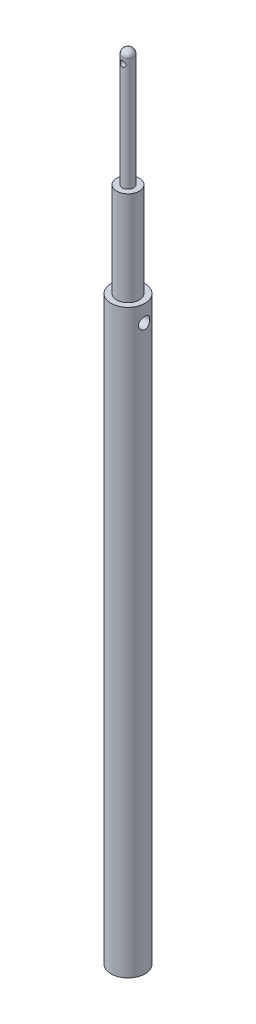
ISO-10303-21;
HEADER;
FILE_DESCRIPTION(('STEP AP214'),'2;1');
FILE_NAME('part.step','',(''),(''),'','','');
FILE_SCHEMA(('AUTOMOTIVE_DESIGN { 1 0 10303 214 1 1 1 1 }'));
ENDSEC;
DATA;
#1=APPLICATION_CONTEXT('core data for automotive mechanical design processes');
#2=APPLICATION_PROTOCOL_DEFINITION('international standard','automotive_design',2000,#1);
#3=PRODUCT_CONTEXT('',#1,'mechanical');
#4=PRODUCT('Part','Part','',(#3));
#5=PRODUCT_RELATED_PRODUCT_CATEGORY('part','',(#4));
#6=PRODUCT_DEFINITION_FORMATION('','',#4);
#7=PRODUCT_DEFINITION_CONTEXT('part definition',#1,'design');
#8=PRODUCT_DEFINITION('design','',#6,#7);
#9=PRODUCT_DEFINITION_SHAPE('','',#8);
#10=(LENGTH_UNIT() NAMED_UNIT(*) SI_UNIT(.MILLI.,.METRE.));
#11=(NAMED_UNIT(*) PLANE_ANGLE_UNIT() SI_UNIT($,.RADIAN.));
#12=(NAMED_UNIT(*) SI_UNIT($,.STERADIAN.) SOLID_ANGLE_UNIT());
#13=UNCERTAINTY_MEASURE_WITH_UNIT(LENGTH_MEASURE(1.E-05),#10,'distance_accuracy_value','');
#14=(GEOMETRIC_REPRESENTATION_CONTEXT(3) GLOBAL_UNCERTAINTY_ASSIGNED_CONTEXT((#13)) GLOBAL_UNIT_ASSIGNED_CONTEXT((#10,
#11,#12)) REPRESENTATION_CONTEXT('',''));
#15=CARTESIAN_POINT('',(0.,0.,0.));
#16=DIRECTION('',(0.,0.,1.));
#17=DIRECTION('',(1.,0.,0.));
#18=AXIS2_PLACEMENT_3D('',#15,#16,#17);
#19=CARTESIAN_POINT('',(0.,418.,0.));
#20=DIRECTION('',(0.,-1.,0.));
#21=DIRECTION('',(-1.,0.,0.));
#22=AXIS2_PLACEMENT_3D('',#19,#20,#21);
#23=SPHERICAL_SURFACE('',#22,3.);
#24=CARTESIAN_POINT('',(0.,421.,0.));
#25=VERTEX_POINT('',#24);
#26=VERTEX_LOOP('',#25);
#27=FACE_BOUND('',#26,.T.);
#28=CARTESIAN_POINT('',(0.,418.,0.));
#29=DIRECTION('',(0.,-1.,0.));
#30=DIRECTION('',(0.,0.,-1.));
#31=AXIS2_PLACEMENT_3D('',#28,#29,#30);
#32=CIRCLE('',#31,3.);
#33=CARTESIAN_POINT('',(0.,418.,-3.));
#34=VERTEX_POINT('',#33);
#35=EDGE_CURVE('E37',#34,#34,#32,.T.);
#36=ORIENTED_EDGE('',*,*,#35,.F.);
#37=EDGE_LOOP('',(#36));
#38=FACE_BOUND('',#37,.T.);
#39=ADVANCED_FACE('F17',(#27,#38),#23,.T.);
#40=CARTESIAN_POINT('',(0.,415.,30.));
#41=DIRECTION('',(0.,0.,-1.));
#42=DIRECTION('',(-1.,0.,0.));
#43=AXIS2_PLACEMENT_3D('',#40,#41,#42);
#44=CYLINDRICAL_SURFACE('',#43,1.5);
#45=CARTESIAN_POINT('',(0.,416.5,3.));
#46=CARTESIAN_POINT('',(0.0789523741883106,416.499997914213,2.9999981238286));
#47=CARTESIAN_POINT('',(0.157924422035615,416.493737423984,2.99685384899897));
#48=CARTESIAN_POINT('',(0.313468681382338,416.468995866764,2.98459986704362));
#49=CARTESIAN_POINT('',(0.390039424776912,416.450507470791,2.97548658233272));
#50=CARTESIAN_POINT('',(0.538393460729509,416.402212709136,2.95224590208733));
#51=CARTESIAN_POINT('',(0.610191918802864,416.372444430996,2.93813539050944));
#52=CARTESIAN_POINT('',(0.747690654482896,416.302654617508,2.90619133889545));
#53=CARTESIAN_POINT('',(0.813389793992892,416.262631173826,2.88835710604406));
#54=CARTESIAN_POINT('',(0.941259980854336,416.170725678538,2.84934448667486));
#55=CARTESIAN_POINT('',(1.00297910670001,416.11827390396,2.8280292644071));
#56=CARTESIAN_POINT('',(1.11716598235844,416.00422104557,2.78490088151737));
#57=CARTESIAN_POINT('',(1.16962611906243,415.942612508662,2.76308732763712));
#58=CARTESIAN_POINT('',(1.2678966211791,415.806250706469,2.71947586721745));
#59=CARTESIAN_POINT('',(1.31287039536179,415.730847279031,2.69781160488922));
#60=CARTESIAN_POINT('',(1.38927657431044,415.57238018469,2.65927731616469));
#61=CARTESIAN_POINT('',(1.42072856328026,415.48932780939,2.64240036823136));
#62=CARTESIAN_POINT('',(1.46288309546822,415.338461546562,2.61923702018133));
#63=CARTESIAN_POINT('',(1.47675163527823,415.271764532079,2.61138198601866));
#64=CARTESIAN_POINT('',(1.49530884891063,415.136716168768,2.60080147997309));
#65=CARTESIAN_POINT('',(1.50000210008705,415.068365662072,2.59807345036424));
#66=CARTESIAN_POINT('',(1.49999759610631,414.921744299183,2.59807937175766));
#67=CARTESIAN_POINT('',(1.49384308337466,414.843468740957,2.60166056499265));
#68=CARTESIAN_POINT('',(1.46956160576775,414.6893774637,2.61544904004607));
#69=CARTESIAN_POINT('',(1.4514242506472,414.61356393939,2.62566207215737));
#70=CARTESIAN_POINT('',(1.40415297324932,414.46682809588,2.65123842070865));
#71=CARTESIAN_POINT('',(1.37507197720972,414.395884148246,2.66657690975751));
#72=CARTESIAN_POINT('',(1.30691055280204,414.2598801163,2.70063556141322));
#73=CARTESIAN_POINT('',(1.26782719972848,414.194821760488,2.71935671264451));
#74=CARTESIAN_POINT('',(1.17700144915982,414.06654330466,2.75995233668311));
#75=CARTESIAN_POINT('',(1.1244818489178,414.003915326102,2.78195952506143));
#76=CARTESIAN_POINT('',(1.00988434252845,413.887890905829,2.82557834533606));
#77=CARTESIAN_POINT('',(0.947801083445087,413.83449966982,2.84718974807806));
#78=CARTESIAN_POINT('',(0.810712291773563,413.734932285602,2.88932940913989));
#79=CARTESIAN_POINT('',(0.735116337207858,413.6894897212,2.90968517210142));
#80=CARTESIAN_POINT('',(0.576173561147554,413.612266616582,2.94527160687147));
#81=CARTESIAN_POINT('',(0.492836933865574,413.580468409015,2.96050890072461));
#82=CARTESIAN_POINT('',(0.341164866635276,413.53771357908,2.98127923258904));
#83=CARTESIAN_POINT('',(0.273898570249011,413.523617159207,2.98825046347326));
#84=CARTESIAN_POINT('',(0.137759532534579,413.504760790713,2.99761101248802));
#85=CARTESIAN_POINT('',(0.0688872548996964,413.499998180116,3.00000163699064));
#86=CARTESIAN_POINT('',(-0.0789523741883066,413.500002085788,2.9999981238286));
#87=CARTESIAN_POINT('',(-0.15792442203561,413.506262576016,2.99685384899897));
#88=CARTESIAN_POINT('',(-0.313468681382333,413.531004133236,2.98459986704362));
#89=CARTESIAN_POINT('',(-0.390039424776908,413.549492529209,2.97548658233272));
#90=CARTESIAN_POINT('',(-0.538393460729497,413.597787290864,2.95224590208734));
#91=CARTESIAN_POINT('',(-0.610191918802843,413.627555569005,2.93813539050945));
#92=CARTESIAN_POINT('',(-0.747690654482877,413.697345382492,2.90619133889545));
#93=CARTESIAN_POINT('',(-0.813389793992883,413.737368826174,2.88835710604407));
#94=CARTESIAN_POINT('',(-0.941259980854335,413.829274321462,2.84934448667486));
#95=CARTESIAN_POINT('',(-1.00297910670001,413.88172609604,2.8280292644071));
#96=CARTESIAN_POINT('',(-1.11716598235844,413.99577895443,2.78490088151737));
#97=CARTESIAN_POINT('',(-1.16962611906243,414.057387491338,2.76308732763712));
#98=CARTESIAN_POINT('',(-1.2678966211791,414.193749293531,2.71947586721745));
#99=CARTESIAN_POINT('',(-1.31287039536179,414.269152720969,2.69781160488922));
#100=CARTESIAN_POINT('',(-1.38927657431045,414.42761981531,2.65927731616469));
#101=CARTESIAN_POINT('',(-1.42072856328026,414.510672190611,2.64240036823136));
#102=CARTESIAN_POINT('',(-1.46288309546822,414.661538453439,2.61923702018132));
#103=CARTESIAN_POINT('',(-1.47675163527823,414.728235467922,2.61138198601866));
#104=CARTESIAN_POINT('',(-1.49530884891063,414.863283831232,2.60080147997309));
#105=CARTESIAN_POINT('',(-1.50000210008706,414.931634337929,2.59807345036423));
#106=CARTESIAN_POINT('',(-1.4999975961063,415.078255700817,2.59807937175766));
#107=CARTESIAN_POINT('',(-1.49384308337464,415.156531259043,2.60166056499266));
#108=CARTESIAN_POINT('',(-1.46956160576772,415.310622536301,2.61544904004609));
#109=CARTESIAN_POINT('',(-1.45142425064716,415.38643606061,2.62566207215739));
#110=CARTESIAN_POINT('',(-1.40415297324927,415.53317190412,2.65123842070868));
#111=CARTESIAN_POINT('',(-1.37507197720967,415.604115851754,2.66657690975753));
#112=CARTESIAN_POINT('',(-1.30691055280198,415.740119883701,2.70063556141325));
#113=CARTESIAN_POINT('',(-1.26782719972841,415.805178239513,2.71935671264454));
#114=CARTESIAN_POINT('',(-1.17700144915974,415.933456695341,2.75995233668315));
#115=CARTESIAN_POINT('',(-1.12448184891771,415.996084673898,2.78195952506147));
#116=CARTESIAN_POINT('',(-1.00988434252833,416.112109094172,2.8255783453361));
#117=CARTESIAN_POINT('',(-0.947801083444956,416.16550033018,2.84718974807811));
#118=CARTESIAN_POINT('',(-0.810712291773417,416.265067714398,2.88932940913993));
#119=CARTESIAN_POINT('',(-0.735116337207713,416.3105102788,2.90968517210146));
#120=CARTESIAN_POINT('',(-0.576173561147404,416.387733383419,2.9452716068715));
#121=CARTESIAN_POINT('',(-0.492836933865418,416.419531590985,2.96050890072464));
#122=CARTESIAN_POINT('',(-0.341164866635138,416.462286420921,2.98127923258905));
#123=CARTESIAN_POINT('',(-0.273898570248898,416.476382840794,2.98825046347327));
#124=CARTESIAN_POINT('',(-0.13775953253452,416.495239209287,2.99761101248802));
#125=CARTESIAN_POINT('',(-0.0688872548996649,416.500001819884,3.00000163699064));
#126=CARTESIAN_POINT('',(0.,416.5,3.));
#127=B_SPLINE_CURVE_WITH_KNOTS('',3,(#45,#46,#47,#48,#49,#50,#51,#52,#53,#54,#55,#56,#57,#58,
#59,#60,#61,#62,#63,#64,#65,#66,#67,#68,#69,#70,#71,#72,#73,#74,#75,#76,#77,#78,#79,#80,#81,#82,
#83,#84,#85,#86,#87,#88,#89,#90,#91,#92,#93,#94,#95,#96,#97,#98,#99,#100,#101,#102,#103,#104,
#105,#106,#107,#108,#109,#110,#111,#112,#113,#114,#115,#116,#117,#118,#119,#120,#121,#122,#123,
#124,#125,#126),.UNSPECIFIED.,.T.,.F.,(4,2,2,2,2,2,2,2,2,2,2,2,2,2,2,2,2,2,2,2,2,2,2,2,2,2,2,2,
2,2,2,2,2,2,2,2,2,2,2,2,4),(0.,0.23659013586564,0.473322204293129,0.709261947423783,
0.945245627395742,1.19546508957278,1.44588934324943,1.7158254376272,1.98536924354221,
2.19032891955666,2.39518631948091,2.6296791761702,2.86437562742736,3.09795131726489,
3.33159538320307,3.58447159376566,3.83748986102485,4.10764473097401,4.37744872835912,
4.58393644104479,4.79036525542416,5.0269553912898,5.26368745971729,5.49962720284793,
5.73561088281991,5.98583034499694,6.23625459867359,6.50619069305137,6.77573449896638,
6.98069417498088,7.18555157490518,7.42004443159454,7.65474088285164,7.88831657268918,
8.12196063862737,8.37483684918999,8.62785511644916,8.89800998639833,9.16781398378345,
9.37430169646904,9.58073051084833),.UNSPECIFIED.);
#128=CARTESIAN_POINT('',(0.,416.5,3.));
#129=VERTEX_POINT('',#128);
#130=EDGE_CURVE('E21',#129,#129,#127,.T.);
#131=ORIENTED_EDGE('',*,*,#130,.F.);
#132=EDGE_LOOP('',(#131));
#133=FACE_BOUND('',#132,.T.);
#134=CARTESIAN_POINT('',(0.,413.5,-3.));
#135=CARTESIAN_POINT('',(0.0789523741883105,413.500002085788,-2.9999981238286));
#136=CARTESIAN_POINT('',(0.157924422035614,413.506262576016,-2.99685384899897));
#137=CARTESIAN_POINT('',(0.313468681382337,413.531004133236,-2.98459986704362));
#138=CARTESIAN_POINT('',(0.390039424776912,413.549492529209,-2.97548658233272));
#139=CARTESIAN_POINT('',(0.538393460729509,413.597787290864,-2.95224590208733));
#140=CARTESIAN_POINT('',(0.610191918802863,413.627555569005,-2.93813539050944));
#141=CARTESIAN_POINT('',(0.747690654482895,413.697345382492,-2.90619133889545));
#142=CARTESIAN_POINT('',(0.813389793992892,413.737368826174,-2.88835710604406));
#143=CARTESIAN_POINT('',(0.941259980854336,413.829274321462,-2.84934448667486));
#144=CARTESIAN_POINT('',(1.00297910670001,413.88172609604,-2.8280292644071));
#145=CARTESIAN_POINT('',(1.11716598235844,413.99577895443,-2.78490088151737));
#146=CARTESIAN_POINT('',(1.16962611906243,414.057387491338,-2.76308732763712));
#147=CARTESIAN_POINT('',(1.2678966211791,414.193749293531,-2.71947586721745));
#148=CARTESIAN_POINT('',(1.31287039536179,414.269152720969,-2.69781160488922));
#149=CARTESIAN_POINT('',(1.38927657431044,414.42761981531,-2.65927731616469));
#150=CARTESIAN_POINT('',(1.42072856328026,414.510672190611,-2.64240036823136));
#151=CARTESIAN_POINT('',(1.46288309546827,414.661538453439,-2.6192370201813));
#152=CARTESIAN_POINT('',(1.4767516352783,414.728235467922,-2.61138198601862));
#153=CARTESIAN_POINT('',(1.4953088489107,414.863283831233,-2.60080147997305));
#154=CARTESIAN_POINT('',(1.5000021000871,414.93163433793,-2.59807345036421));
#155=CARTESIAN_POINT('',(1.49999759610625,415.078255700818,-2.59807937175769));
#156=CARTESIAN_POINT('',(1.49384308337454,415.156531259044,-2.60166056499272));
#157=CARTESIAN_POINT('',(1.46956160576752,415.310622536302,-2.6154490400462));
#158=CARTESIAN_POINT('',(1.4514242506469,415.386436060611,-2.62566207215753));
#159=CARTESIAN_POINT('',(1.40415297324892,415.533171904121,-2.65123842070886));
#160=CARTESIAN_POINT('',(1.37507197720927,415.604115851755,-2.66657690975774));
#161=CARTESIAN_POINT('',(1.30691055280148,415.740119883701,-2.7006355614135));
#162=CARTESIAN_POINT('',(1.26782719972784,415.805178239514,-2.71935671264481));
#163=CARTESIAN_POINT('',(1.17700144915905,415.933456695342,-2.75995233668344));
#164=CARTESIAN_POINT('',(1.12448184891698,415.996084673899,-2.78195952506177));
#165=CARTESIAN_POINT('',(1.0098843425275,416.112109094173,-2.8255783453364));
#166=CARTESIAN_POINT('',(0.947801083444077,416.165500330181,-2.8471897480784));
#167=CARTESIAN_POINT('',(0.810712291772438,416.265067714398,-2.8893294091402));
#168=CARTESIAN_POINT('',(0.735116337206682,416.310510278801,-2.90968517210172));
#169=CARTESIAN_POINT('',(0.576173561146288,416.387733383419,-2.94527160687172));
#170=CARTESIAN_POINT('',(0.49283693386427,416.419531590986,-2.96050890072483));
#171=CARTESIAN_POINT('',(0.341164866634147,416.462286420921,-2.98127923258916));
#172=CARTESIAN_POINT('',(0.2738985702481,416.476382840794,-2.98825046347334));
#173=CARTESIAN_POINT('',(0.137759532534115,416.495239209287,-2.99761101248804));
#174=CARTESIAN_POINT('',(0.0688872548994613,416.500001819884,-3.00000163699064));
#175=CARTESIAN_POINT('',(-0.0789523741883184,416.499997914213,-2.9999981238286));
#176=CARTESIAN_POINT('',(-0.157924422035628,416.493737423984,-2.99685384899897));
#177=CARTESIAN_POINT('',(-0.313468681382351,416.468995866764,-2.98459986704362));
#178=CARTESIAN_POINT('',(-0.39003942477692,416.450507470791,-2.97548658233272));
#179=CARTESIAN_POINT('',(-0.538393460729512,416.402212709136,-2.95224590208733));
#180=CARTESIAN_POINT('',(-0.610191918802866,416.372444430996,-2.93813539050944));
#181=CARTESIAN_POINT('',(-0.747690654482898,416.302654617508,-2.90619133889545));
#182=CARTESIAN_POINT('',(-0.813389793992895,416.262631173826,-2.88835710604406));
#183=CARTESIAN_POINT('',(-0.941259980854337,416.170725678538,-2.84934448667486));
#184=CARTESIAN_POINT('',(-1.00297910670001,416.11827390396,-2.8280292644071));
#185=CARTESIAN_POINT('',(-1.11716598235844,416.00422104557,-2.78490088151737));
#186=CARTESIAN_POINT('',(-1.16962611906243,415.942612508662,-2.76308732763711));
#187=CARTESIAN_POINT('',(-1.26789662117911,415.806250706469,-2.71947586721744));
#188=CARTESIAN_POINT('',(-1.31287039536181,415.730847279031,-2.69781160488921));
#189=CARTESIAN_POINT('',(-1.38927657431046,415.57238018469,-2.65927731616468));
#190=CARTESIAN_POINT('',(-1.42072856328028,415.48932780939,-2.64240036823135));
#191=CARTESIAN_POINT('',(-1.46288309546823,415.338461546561,-2.61923702018132));
#192=CARTESIAN_POINT('',(-1.47675163527824,415.271764532079,-2.61138198601865));
#193=CARTESIAN_POINT('',(-1.49530884891062,415.136716168768,-2.60080147997309));
#194=CARTESIAN_POINT('',(-1.50000210008705,415.068365662072,-2.59807345036424));
#195=CARTESIAN_POINT('',(-1.49999759610631,414.921744299183,-2.59807937175766));
#196=CARTESIAN_POINT('',(-1.49384308337466,414.843468740957,-2.60166056499265));
#197=CARTESIAN_POINT('',(-1.46956160576774,414.6893774637,-2.61544904004607));
#198=CARTESIAN_POINT('',(-1.45142425064719,414.61356393939,-2.62566207215737));
#199=CARTESIAN_POINT('',(-1.40415297324932,414.46682809588,-2.65123842070865));
#200=CARTESIAN_POINT('',(-1.37507197720972,414.395884148246,-2.66657690975751));
#201=CARTESIAN_POINT('',(-1.30691055280204,414.2598801163,-2.70063556141322));
#202=CARTESIAN_POINT('',(-1.26782719972848,414.194821760488,-2.71935671264451));
#203=CARTESIAN_POINT('',(-1.17700144915982,414.06654330466,-2.75995233668311));
#204=CARTESIAN_POINT('',(-1.1244818489178,414.003915326102,-2.78195952506143));
#205=CARTESIAN_POINT('',(-1.00988434252845,413.887890905829,-2.82557834533606));
#206=CARTESIAN_POINT('',(-0.947801083445088,413.83449966982,-2.84718974807806));
#207=CARTESIAN_POINT('',(-0.810712291773557,413.734932285602,-2.88932940913989));
#208=CARTESIAN_POINT('',(-0.735116337207843,413.6894897212,-2.90968517210142));
#209=CARTESIAN_POINT('',(-0.576173561147538,413.612266616582,-2.94527160687148));
#210=CARTESIAN_POINT('',(-0.492836933865567,413.580468409015,-2.96050890072461));
#211=CARTESIAN_POINT('',(-0.341164866635277,413.53771357908,-2.98127923258904));
#212=CARTESIAN_POINT('',(-0.273898570249011,413.523617159207,-2.98825046347326));
#213=CARTESIAN_POINT('',(-0.137759532534577,413.504760790713,-2.99761101248802));
#214=CARTESIAN_POINT('',(-0.0688872548996934,413.499998180116,-3.00000163699064));
#215=CARTESIAN_POINT('',(0.,413.5,-3.));
#216=B_SPLINE_CURVE_WITH_KNOTS('',3,(#134,#135,#136,#137,#138,#139,#140,#141,#142,#143,#144,
#145,#146,#147,#148,#149,#150,#151,#152,#153,#154,#155,#156,#157,#158,#159,#160,#161,#162,#163,
#164,#165,#166,#167,#168,#169,#170,#171,#172,#173,#174,#175,#176,#177,#178,#179,#180,#181,#182,
#183,#184,#185,#186,#187,#188,#189,#190,#191,#192,#193,#194,#195,#196,#197,#198,#199,#200,#201,
#202,#203,#204,#205,#206,#207,#208,#209,#210,#211,#212,#213,#214,#215),.UNSPECIFIED.,.T.,.F.,(4,
2,2,2,2,2,2,2,2,2,2,2,2,2,2,2,2,2,2,2,2,2,2,2,2,2,2,2,2,2,2,2,2,2,2,2,2,2,2,2,4),(0.,
0.236590135865639,0.473322204293129,0.709261947423783,0.945245627395742,1.19546508957278,
1.44588934324943,1.7158254376272,1.98536924354221,2.19032891955717,2.39518631948196,
2.62967917617133,2.86437562742848,3.09795131726609,3.33159538320433,3.58447159376696,
3.83748986102621,4.10764473097541,4.37744872836052,4.5839364410455,4.79036525542418,
5.02695539128984,5.26368745971731,5.49962720284796,5.73561088281992,5.98583034499696,
6.23625459867361,6.50619069305144,6.77573449896645,6.98069417498084,7.18555157490503,
7.42004443159444,7.65474088285154,7.88831657268907,8.12196063862725,8.37483684918984,
8.62785511644903,8.89800998639821,9.1678139837833,9.37430169646897,9.58073051084835),.UNSPECIFIED.);
#217=CARTESIAN_POINT('',(0.,413.5,-3.));
#218=VERTEX_POINT('',#217);
#219=EDGE_CURVE('E41',#218,#218,#216,.T.);
#220=ORIENTED_EDGE('',*,*,#219,.F.);
#221=EDGE_LOOP('',(#220));
#222=FACE_BOUND('',#221,.T.);
#223=ADVANCED_FACE('F34',(#133,#222),#44,.F.);
#224=CARTESIAN_POINT('',(0.,418.,0.));
#225=DIRECTION('',(0.,-1.,0.));
#226=DIRECTION('',(0.,0.,-1.));
#227=AXIS2_PLACEMENT_3D('',#224,#225,#226);
#228=CYLINDRICAL_SURFACE('',#227,3.);
#229=ORIENTED_EDGE('',*,*,#130,.T.);
#230=EDGE_LOOP('',(#229));
#231=FACE_BOUND('',#230,.T.);
#232=CARTESIAN_POINT('',(0.,358.,0.));
#233=DIRECTION('',(0.,-1.,0.));
#234=DIRECTION('',(0.,0.,-1.));
#235=AXIS2_PLACEMENT_3D('',#232,#233,#234);
#236=CIRCLE('',#235,3.);
#237=CARTESIAN_POINT('',(0.,358.,-3.));
#238=VERTEX_POINT('',#237);
#239=EDGE_CURVE('E88',#238,#238,#236,.T.);
#240=ORIENTED_EDGE('',*,*,#239,.F.);
#241=EDGE_LOOP('',(#240));
#242=FACE_BOUND('',#241,.T.);
#243=ORIENTED_EDGE('',*,*,#219,.T.);
#244=EDGE_LOOP('',(#243));
#245=FACE_BOUND('',#244,.T.);
#246=ORIENTED_EDGE('',*,*,#35,.T.);
#247=EDGE_LOOP('',(#246));
#248=FACE_BOUND('',#247,.T.);
#249=ADVANCED_FACE('F96',(#231,#242,#245,#248),#228,.T.);
#250=CARTESIAN_POINT('',(0.,358.,0.));
#251=DIRECTION('',(0.,1.,0.));
#252=DIRECTION('',(0.,0.,1.));
#253=AXIS2_PLACEMENT_3D('',#250,#251,#252);
#254=PLANE('',#253);
#255=CARTESIAN_POINT('',(0.,358.,0.));
#256=DIRECTION('',(0.,-1.,0.));
#257=DIRECTION('',(0.,0.,-1.));
#258=AXIS2_PLACEMENT_3D('',#255,#256,#257);
#259=CIRCLE('',#258,6.);
#260=CARTESIAN_POINT('',(0.,358.,-6.));
#261=VERTEX_POINT('',#260);
#262=EDGE_CURVE('E85',#261,#261,#259,.T.);
#263=ORIENTED_EDGE('',*,*,#262,.F.);
#264=EDGE_LOOP('',(#263));
#265=FACE_BOUND('',#264,.T.);
#266=ORIENTED_EDGE('',*,*,#239,.T.);
#267=EDGE_LOOP('',(#266));
#268=FACE_BOUND('',#267,.T.);
#269=ADVANCED_FACE('F100',(#265,#268),#254,.T.);
#270=CARTESIAN_POINT('',(0.,358.,0.));
#271=DIRECTION('',(0.,-1.,0.));
#272=DIRECTION('',(0.,0.,-1.));
#273=AXIS2_PLACEMENT_3D('',#270,#271,#272);
#274=CYLINDRICAL_SURFACE('',#273,6.);
#275=CARTESIAN_POINT('',(0.,308.,0.));
#276=DIRECTION('',(0.,-1.,0.));
#277=DIRECTION('',(0.,0.,-1.));
#278=AXIS2_PLACEMENT_3D('',#275,#276,#277);
#279=CIRCLE('',#278,6.);
#280=CARTESIAN_POINT('',(0.,308.,-6.));
#281=VERTEX_POINT('',#280);
#282=EDGE_CURVE('E83',#281,#281,#279,.T.);
#283=ORIENTED_EDGE('',*,*,#282,.F.);
#284=EDGE_LOOP('',(#283));
#285=FACE_BOUND('',#284,.T.);
#286=ORIENTED_EDGE('',*,*,#262,.T.);
#287=EDGE_LOOP('',(#286));
#288=FACE_BOUND('',#287,.T.);
#289=ADVANCED_FACE('F77',(#285,#288),#274,.T.);
#290=CARTESIAN_POINT('',(-100.,299.,0.));
#291=DIRECTION('',(1.,0.,0.));
#292=DIRECTION('',(0.,0.,-1.));
#293=AXIS2_PLACEMENT_3D('',#290,#291,#292);
#294=CYLINDRICAL_SURFACE('',#293,3.);
#295=CARTESIAN_POINT('',(-8.48528137423857,299.,3.));
#296=CARTESIAN_POINT('',(-8.48528939269806,298.836822266373,2.99999057574607));
#297=CARTESIAN_POINT('',(-8.49004787947491,298.673474729012,2.98662243405114));
#298=CARTESIAN_POINT('',(-8.50850391093655,298.35145432446,2.93361716359227));
#299=CARTESIAN_POINT('',(-8.52221666864548,298.192789894088,2.89393532690681));
#300=CARTESIAN_POINT('',(-8.55684941737962,297.885102294616,2.78985757633644));
#301=CARTESIAN_POINT('',(-8.57775083472522,297.73605544332,2.72552530454461));
#302=CARTESIAN_POINT('',(-8.6243815469595,297.450875332003,2.57415784957441));
#303=CARTESIAN_POINT('',(-8.65011040081627,297.314740894019,2.48712474004882));
#304=CARTESIAN_POINT('',(-8.70463401950958,297.053844050527,2.28915595790227));
#305=CARTESIAN_POINT('',(-8.73350539040839,296.929660172132,2.1774786891063));
#306=CARTESIAN_POINT('',(-8.79041450872502,296.701384730883,1.9349696526192));
#307=CARTESIAN_POINT('',(-8.81845207891969,296.597297414065,1.80413384732452));
#308=CARTESIAN_POINT('',(-8.87141606960444,296.40956314146,1.5228132102868));
#309=CARTESIAN_POINT('',(-8.89624233857616,296.326519741858,1.37190508326079));
#310=CARTESIAN_POINT('',(-8.93908767956206,296.187224992763,1.05729296853428));
#311=CARTESIAN_POINT('',(-8.95710861493405,296.130966308289,0.893592498323382));
#312=CARTESIAN_POINT('',(-8.98377226169277,296.048792443172,0.564086470134402));
#313=CARTESIAN_POINT('',(-8.99271944142283,296.021889667107,0.3985523011008));
#314=CARTESIAN_POINT('',(-9.00130824656327,295.996051119723,0.0650936612409963));
#315=CARTESIAN_POINT('',(-9.00095226842481,295.997108146087,-0.102830182876531));
#316=CARTESIAN_POINT('',(-8.99118119848709,296.02653273125,-0.429310213742429));
#317=CARTESIAN_POINT('',(-8.98212198015685,296.053827462253,-0.587975486646448));
#318=CARTESIAN_POINT('',(-8.95640908958578,296.133178736199,-0.898329685312875));
#319=CARTESIAN_POINT('',(-8.93975487117971,296.185237059933,-1.05001810849822));
#320=CARTESIAN_POINT('',(-8.90026958997981,296.313265593657,-1.34446128305114));
#321=CARTESIAN_POINT('',(-8.87736007705977,296.389541653433,-1.48707209088443));
#322=CARTESIAN_POINT('',(-8.8277503992242,296.563584367053,-1.7577796840744));
#323=CARTESIAN_POINT('',(-8.80104937773078,296.661355879895,-1.88587317788767));
#324=CARTESIAN_POINT('',(-8.74519057626615,296.881003632898,-2.1302814274573));
#325=CARTESIAN_POINT('',(-8.71597630772003,297.003795805453,-2.24576123978231));
#326=CARTESIAN_POINT('',(-8.6594293582893,297.267300602181,-2.45480021609739));
#327=CARTESIAN_POINT('',(-8.63209760947488,297.408022006571,-2.54834857574099));
#328=CARTESIAN_POINT('',(-8.58209399574175,297.706081806228,-2.71203256531343));
#329=CARTESIAN_POINT('',(-8.55949793263354,297.863637236975,-2.78179713345572));
#330=CARTESIAN_POINT('',(-8.52242497482471,298.189033591836,-2.8934041425067));
#331=CARTESIAN_POINT('',(-8.5079308645639,298.35685185992,-2.93530582452219));
#332=CARTESIAN_POINT('',(-8.49409890889341,298.605204930321,-2.97496589166888));
#333=CARTESIAN_POINT('',(-8.49080379551609,298.683821384374,-2.98434170003835));
#334=CARTESIAN_POINT('',(-8.48639307663688,298.841611885261,-2.99686105680227));
#335=CARTESIAN_POINT('',(-8.4852774817052,298.920785934798,-3.00000457497141));
#336=CARTESIAN_POINT('',(-8.48528939269806,299.163177733627,-2.99999057574607));
#337=CARTESIAN_POINT('',(-8.49004787947491,299.326525270988,-2.98662243405114));
#338=CARTESIAN_POINT('',(-8.50850391093655,299.648545675541,-2.93361716359227));
#339=CARTESIAN_POINT('',(-8.52221666864548,299.807210105912,-2.89393532690681));
#340=CARTESIAN_POINT('',(-8.55684941737962,300.114897705384,-2.78985757633644));
#341=CARTESIAN_POINT('',(-8.57775083472522,300.26394455668,-2.72552530454461));
#342=CARTESIAN_POINT('',(-8.6243815469595,300.549124667997,-2.57415784957441));
#343=CARTESIAN_POINT('',(-8.65011040081627,300.685259105981,-2.48712474004882));
#344=CARTESIAN_POINT('',(-8.70463401950959,300.946155949473,-2.28915595790225));
#345=CARTESIAN_POINT('',(-8.7335053904084,301.070339827868,-2.17747868910626));
#346=CARTESIAN_POINT('',(-8.79041450872503,301.298615269117,-1.93496965261916));
#347=CARTESIAN_POINT('',(-8.81845207891969,301.402702585935,-1.80413384732449));
#348=CARTESIAN_POINT('',(-8.87141606960444,301.59043685854,-1.5228132102868));
#349=CARTESIAN_POINT('',(-8.89624233857616,301.673480258142,-1.37190508326079));
#350=CARTESIAN_POINT('',(-8.93908767956206,301.812775007237,-1.05729296853428));
#351=CARTESIAN_POINT('',(-8.95710861493405,301.869033691711,-0.893592498323382));
#352=CARTESIAN_POINT('',(-8.98377226169277,301.951207556828,-0.564086470134402));
#353=CARTESIAN_POINT('',(-8.99271944142283,301.978110332893,-0.3985523011008));
#354=CARTESIAN_POINT('',(-9.00130824656327,302.003948880277,-0.0650936612409963));
#355=CARTESIAN_POINT('',(-9.00095226842481,302.002891853913,0.102830182876531));
#356=CARTESIAN_POINT('',(-8.99118119848709,301.97346726875,0.429310213742428));
#357=CARTESIAN_POINT('',(-8.98212198015685,301.946172537747,0.587975486646448));
#358=CARTESIAN_POINT('',(-8.95640908958578,301.866821263801,0.898329685312874));
#359=CARTESIAN_POINT('',(-8.93975487117971,301.814762940068,1.05001810849822));
#360=CARTESIAN_POINT('',(-8.90026958997981,301.686734406344,1.34446128305114));
#361=CARTESIAN_POINT('',(-8.87736007705977,301.610458346567,1.48707209088443));
#362=CARTESIAN_POINT('',(-8.8277503992242,301.436415632947,1.7577796840744));
#363=CARTESIAN_POINT('',(-8.80104937773078,301.338644120105,1.88587317788767));
#364=CARTESIAN_POINT('',(-8.74519057626615,301.118996367102,2.1302814274573));
#365=CARTESIAN_POINT('',(-8.71597630772003,300.996204194547,2.24576123978231));
#366=CARTESIAN_POINT('',(-8.6594293582893,300.73269939782,2.45480021609739));
#367=CARTESIAN_POINT('',(-8.63209760947488,300.591977993429,2.54834857574099));
#368=CARTESIAN_POINT('',(-8.58209399574175,300.293918193773,2.71203256531343));
#369=CARTESIAN_POINT('',(-8.55949793263353,300.136362763025,2.78179713345572));
#370=CARTESIAN_POINT('',(-8.52242497482471,299.810966408164,2.8934041425067));
#371=CARTESIAN_POINT('',(-8.5079308645639,299.64314814008,2.93530582452219));
#372=CARTESIAN_POINT('',(-8.49409890889341,299.394795069679,2.97496589166888));
#373=CARTESIAN_POINT('',(-8.49080379551609,299.316178615627,2.98434170003835));
#374=CARTESIAN_POINT('',(-8.48639307663688,299.158388114739,2.99686105680227));
#375=CARTESIAN_POINT('',(-8.48527748170521,299.079214065202,3.00000457497141));
#376=CARTESIAN_POINT('',(-8.48528137423857,299.,3.));
#377=B_SPLINE_CURVE_WITH_KNOTS('',3,(#295,#296,#297,#298,#299,#300,#301,#302,#303,#304,#305,
#306,#307,#308,#309,#310,#311,#312,#313,#314,#315,#316,#317,#318,#319,#320,#321,#322,#323,#324,
#325,#326,#327,#328,#329,#330,#331,#332,#333,#334,#335,#336,#337,#338,#339,#340,#341,#342,#343,
#344,#345,#346,#347,#348,#349,#350,#351,#352,#353,#354,#355,#356,#357,#358,#359,#360,#361,#362,
#363,#364,#365,#366,#367,#368,#369,#370,#371,#372,#373,#374,#375,#376),.UNSPECIFIED.,.T.,.F.,(4,
2,2,2,2,2,2,2,2,2,2,2,2,2,2,2,2,2,2,2,2,2,2,2,2,2,2,2,2,2,2,2,2,2,2,2,2,2,2,2,4),(0.,
0.489225423586789,0.979284195953487,1.46808617585735,1.95684352080855,2.46302733363521,
2.96931797710965,3.48880631720968,4.00815231370483,4.50942953016606,5.01057762116896,
5.4920691694821,5.97359534786971,6.46146236517416,6.94943977730705,7.46031901403269,
7.97144940473348,8.49022379203396,9.00789162198889,9.24538325639305,9.4828760425791,
9.9721014661659,10.4621602385326,10.9509622184365,11.4397195633877,11.9459033762144,
12.4521940196888,12.9716823597888,13.4910283562839,13.9923055727452,14.4934536637481,
14.9749452120612,15.4564713904488,15.9443384077533,16.4323158198862,16.9431950566118,
17.4543254473126,17.9730998346131,18.490767664568,18.7282592989722,18.9657520851582),.UNSPECIFIED.);
#378=CARTESIAN_POINT('',(-8.48528137423857,299.,3.));
#379=VERTEX_POINT('',#378);
#380=EDGE_CURVE('E53',#379,#379,#377,.T.);
#381=ORIENTED_EDGE('',*,*,#380,.F.);
#382=EDGE_LOOP('',(#381));
#383=FACE_BOUND('',#382,.T.);
#384=CARTESIAN_POINT('',(8.48528137423857,299.,-3.));
#385=CARTESIAN_POINT('',(8.48528939269806,298.836822266373,-2.99999057574607));
#386=CARTESIAN_POINT('',(8.49004787947491,298.673474729012,-2.98662243405114));
#387=CARTESIAN_POINT('',(8.50850391093655,298.35145432446,-2.93361716359227));
#388=CARTESIAN_POINT('',(8.52221666864548,298.192789894088,-2.89393532690681));
#389=CARTESIAN_POINT('',(8.55684941737962,297.885102294616,-2.78985757633644));
#390=CARTESIAN_POINT('',(8.57775083472522,297.73605544332,-2.72552530454461));
#391=CARTESIAN_POINT('',(8.6243815469595,297.450875332003,-2.57415784957441));
#392=CARTESIAN_POINT('',(8.65011040081627,297.314740894019,-2.48712474004882));
#393=CARTESIAN_POINT('',(8.70463401950958,297.053844050527,-2.28915595790227));
#394=CARTESIAN_POINT('',(8.73350539040839,296.929660172132,-2.1774786891063));
#395=CARTESIAN_POINT('',(8.79041450872502,296.701384730883,-1.9349696526192));
#396=CARTESIAN_POINT('',(8.81845207891969,296.597297414065,-1.80413384732452));
#397=CARTESIAN_POINT('',(8.87141606960444,296.40956314146,-1.5228132102868));
#398=CARTESIAN_POINT('',(8.89624233857616,296.326519741858,-1.37190508326079));
#399=CARTESIAN_POINT('',(8.93908767956206,296.187224992763,-1.05729296853428));
#400=CARTESIAN_POINT('',(8.95710861493405,296.130966308289,-0.893592498323382));
#401=CARTESIAN_POINT('',(8.98377226169277,296.048792443172,-0.564086470134402));
#402=CARTESIAN_POINT('',(8.99271944142283,296.021889667107,-0.3985523011008));
#403=CARTESIAN_POINT('',(9.00130824656327,295.996051119723,-0.0650936612409963));
#404=CARTESIAN_POINT('',(9.00095226842481,295.997108146087,0.102830182876531));
#405=CARTESIAN_POINT('',(8.99118119848709,296.02653273125,0.429310213742429));
#406=CARTESIAN_POINT('',(8.98212198015685,296.053827462253,0.587975486646448));
#407=CARTESIAN_POINT('',(8.95640908958578,296.133178736199,0.898329685312875));
#408=CARTESIAN_POINT('',(8.93975487117971,296.185237059933,1.05001810849822));
#409=CARTESIAN_POINT('',(8.90026958997981,296.313265593657,1.34446128305114));
#410=CARTESIAN_POINT('',(8.87736007705977,296.389541653433,1.48707209088443));
#411=CARTESIAN_POINT('',(8.8277503992242,296.563584367053,1.7577796840744));
#412=CARTESIAN_POINT('',(8.80104937773078,296.661355879895,1.88587317788767));
#413=CARTESIAN_POINT('',(8.74519057626615,296.881003632898,2.1302814274573));
#414=CARTESIAN_POINT('',(8.71597630772003,297.003795805453,2.24576123978231));
#415=CARTESIAN_POINT('',(8.6594293582893,297.267300602181,2.45480021609739));
#416=CARTESIAN_POINT('',(8.63209760947488,297.408022006571,2.54834857574099));
#417=CARTESIAN_POINT('',(8.58209399574175,297.706081806228,2.71203256531343));
#418=CARTESIAN_POINT('',(8.55949793263354,297.863637236975,2.78179713345572));
#419=CARTESIAN_POINT('',(8.52242497482471,298.189033591836,2.8934041425067));
#420=CARTESIAN_POINT('',(8.5079308645639,298.35685185992,2.93530582452219));
#421=CARTESIAN_POINT('',(8.49409890889341,298.605204930321,2.97496589166888));
#422=CARTESIAN_POINT('',(8.49080379551609,298.683821384374,2.98434170003835));
#423=CARTESIAN_POINT('',(8.48639307663688,298.841611885261,2.99686105680227));
#424=CARTESIAN_POINT('',(8.4852774817052,298.920785934798,3.00000457497141));
#425=CARTESIAN_POINT('',(8.48528939269806,299.163177733627,2.99999057574607));
#426=CARTESIAN_POINT('',(8.49004787947491,299.326525270988,2.98662243405114));
#427=CARTESIAN_POINT('',(8.50850391093655,299.648545675541,2.93361716359227));
#428=CARTESIAN_POINT('',(8.52221666864548,299.807210105912,2.89393532690681));
#429=CARTESIAN_POINT('',(8.55684941737962,300.114897705384,2.78985757633644));
#430=CARTESIAN_POINT('',(8.57775083472522,300.26394455668,2.72552530454461));
#431=CARTESIAN_POINT('',(8.6243815469595,300.549124667997,2.57415784957441));
#432=CARTESIAN_POINT('',(8.65011040081627,300.685259105981,2.48712474004882));
#433=CARTESIAN_POINT('',(8.70463401950959,300.946155949473,2.28915595790225));
#434=CARTESIAN_POINT('',(8.7335053904084,301.070339827868,2.17747868910626));
#435=CARTESIAN_POINT('',(8.79041450872503,301.298615269117,1.93496965261916));
#436=CARTESIAN_POINT('',(8.81845207891969,301.402702585935,1.80413384732449));
#437=CARTESIAN_POINT('',(8.87141606960444,301.59043685854,1.5228132102868));
#438=CARTESIAN_POINT('',(8.89624233857616,301.673480258142,1.37190508326079));
#439=CARTESIAN_POINT('',(8.93908767956206,301.812775007237,1.05729296853428));
#440=CARTESIAN_POINT('',(8.95710861493405,301.869033691711,0.893592498323382));
#441=CARTESIAN_POINT('',(8.98377226169277,301.951207556828,0.564086470134402));
#442=CARTESIAN_POINT('',(8.99271944142283,301.978110332893,0.3985523011008));
#443=CARTESIAN_POINT('',(9.00130824656327,302.003948880277,0.0650936612409963));
#444=CARTESIAN_POINT('',(9.00095226842481,302.002891853913,-0.102830182876531));
#445=CARTESIAN_POINT('',(8.99118119848709,301.97346726875,-0.429310213742428));
#446=CARTESIAN_POINT('',(8.98212198015685,301.946172537747,-0.587975486646448));
#447=CARTESIAN_POINT('',(8.95640908958578,301.866821263801,-0.898329685312874));
#448=CARTESIAN_POINT('',(8.93975487117971,301.814762940068,-1.05001810849822));
#449=CARTESIAN_POINT('',(8.90026958997981,301.686734406344,-1.34446128305114));
#450=CARTESIAN_POINT('',(8.87736007705977,301.610458346567,-1.48707209088443));
#451=CARTESIAN_POINT('',(8.8277503992242,301.436415632947,-1.7577796840744));
#452=CARTESIAN_POINT('',(8.80104937773078,301.338644120105,-1.88587317788767));
#453=CARTESIAN_POINT('',(8.74519057626615,301.118996367102,-2.1302814274573));
#454=CARTESIAN_POINT('',(8.71597630772003,300.996204194547,-2.24576123978231));
#455=CARTESIAN_POINT('',(8.6594293582893,300.73269939782,-2.45480021609739));
#456=CARTESIAN_POINT('',(8.63209760947488,300.591977993429,-2.54834857574099));
#457=CARTESIAN_POINT('',(8.58209399574175,300.293918193773,-2.71203256531343));
#458=CARTESIAN_POINT('',(8.55949793263353,300.136362763025,-2.78179713345572));
#459=CARTESIAN_POINT('',(8.52242497482471,299.810966408164,-2.8934041425067));
#460=CARTESIAN_POINT('',(8.5079308645639,299.64314814008,-2.93530582452219));
#461=CARTESIAN_POINT('',(8.49409890889341,299.394795069679,-2.97496589166888));
#462=CARTESIAN_POINT('',(8.49080379551609,299.316178615627,-2.98434170003835));
#463=CARTESIAN_POINT('',(8.48639307663688,299.158388114739,-2.99686105680227));
#464=CARTESIAN_POINT('',(8.48527748170521,299.079214065202,-3.00000457497141));
#465=CARTESIAN_POINT('',(8.48528137423857,299.,-3.));
#466=B_SPLINE_CURVE_WITH_KNOTS('',3,(#384,#385,#386,#387,#388,#389,#390,#391,#392,#393,#394,
#395,#396,#397,#398,#399,#400,#401,#402,#403,#404,#405,#406,#407,#408,#409,#410,#411,#412,#413,
#414,#415,#416,#417,#418,#419,#420,#421,#422,#423,#424,#425,#426,#427,#428,#429,#430,#431,#432,
#433,#434,#435,#436,#437,#438,#439,#440,#441,#442,#443,#444,#445,#446,#447,#448,#449,#450,#451,
#452,#453,#454,#455,#456,#457,#458,#459,#460,#461,#462,#463,#464,#465),.UNSPECIFIED.,.T.,.F.,(4,
2,2,2,2,2,2,2,2,2,2,2,2,2,2,2,2,2,2,2,2,2,2,2,2,2,2,2,2,2,2,2,2,2,2,2,2,2,2,2,4),(0.,
0.489225423586789,0.979284195953487,1.46808617585735,1.95684352080855,2.46302733363521,
2.96931797710965,3.48880631720968,4.00815231370483,4.50942953016606,5.01057762116896,
5.4920691694821,5.97359534786971,6.46146236517416,6.94943977730705,7.46031901403269,
7.97144940473348,8.49022379203396,9.00789162198889,9.24538325639305,9.4828760425791,
9.9721014661659,10.4621602385326,10.9509622184365,11.4397195633877,11.9459033762144,
12.4521940196888,12.9716823597888,13.4910283562839,13.9923055727452,14.4934536637481,
14.9749452120612,15.4564713904488,15.9443384077533,16.4323158198862,16.9431950566118,
17.4543254473126,17.9730998346131,18.490767664568,18.7282592989722,18.9657520851582),.UNSPECIFIED.);
#467=CARTESIAN_POINT('',(8.48528137423857,299.,-3.));
#468=VERTEX_POINT('',#467);
#469=EDGE_CURVE('E46',#468,#468,#466,.T.);
#470=ORIENTED_EDGE('',*,*,#469,.F.);
#471=EDGE_LOOP('',(#470));
#472=FACE_BOUND('',#471,.T.);
#473=ADVANCED_FACE('F57',(#383,#472),#294,.F.);
#474=CARTESIAN_POINT('',(0.,308.,0.));
#475=DIRECTION('',(0.,1.,0.));
#476=DIRECTION('',(0.,0.,1.));
#477=AXIS2_PLACEMENT_3D('',#474,#475,#476);
#478=PLANE('',#477);
#479=CARTESIAN_POINT('',(0.,308.,0.));
#480=DIRECTION('',(0.,-1.,0.));
#481=DIRECTION('',(0.,0.,-1.));
#482=AXIS2_PLACEMENT_3D('',#479,#480,#481);
#483=CIRCLE('',#482,9.);
#484=CARTESIAN_POINT('',(0.,308.,-9.));
#485=VERTEX_POINT('',#484);
#486=EDGE_CURVE('E28',#485,#485,#483,.T.);
#487=ORIENTED_EDGE('',*,*,#486,.F.);
#488=EDGE_LOOP('',(#487));
#489=FACE_BOUND('',#488,.T.);
#490=ORIENTED_EDGE('',*,*,#282,.T.);
#491=EDGE_LOOP('',(#490));
#492=FACE_BOUND('',#491,.T.);
#493=ADVANCED_FACE('F69',(#489,#492),#478,.T.);
#494=CARTESIAN_POINT('',(0.,0.,0.));
#495=DIRECTION('',(0.,1.,0.));
#496=DIRECTION('',(0.,0.,1.));
#497=AXIS2_PLACEMENT_3D('',#494,#495,#496);
#498=PLANE('',#497);
#499=CARTESIAN_POINT('',(0.,0.,0.));
#500=DIRECTION('',(0.,-1.,0.));
#501=DIRECTION('',(0.,0.,-1.));
#502=AXIS2_PLACEMENT_3D('',#499,#500,#501);
#503=CIRCLE('',#502,9.);
#504=CARTESIAN_POINT('',(0.,0.,-9.));
#505=VERTEX_POINT('',#504);
#506=EDGE_CURVE('E11',#505,#505,#503,.F.);
#507=ORIENTED_EDGE('',*,*,#506,.F.);
#508=EDGE_LOOP('',(#507));
#509=FACE_BOUND('',#508,.T.);
#510=ADVANCED_FACE('F65',(#509),#498,.F.);
#511=CARTESIAN_POINT('',(0.,308.,0.));
#512=DIRECTION('',(0.,-1.,0.));
#513=DIRECTION('',(0.,0.,-1.));
#514=AXIS2_PLACEMENT_3D('',#511,#512,#513);
#515=CYLINDRICAL_SURFACE('',#514,9.);
#516=ORIENTED_EDGE('',*,*,#506,.T.);
#517=EDGE_LOOP('',(#516));
#518=FACE_BOUND('',#517,.T.);
#519=ORIENTED_EDGE('',*,*,#486,.T.);
#520=EDGE_LOOP('',(#519));
#521=FACE_BOUND('',#520,.T.);
#522=ORIENTED_EDGE('',*,*,#469,.T.);
#523=EDGE_LOOP('',(#522));
#524=FACE_BOUND('',#523,.T.);
#525=ORIENTED_EDGE('',*,*,#380,.T.);
#526=EDGE_LOOP('',(#525));
#527=FACE_BOUND('',#526,.T.);
#528=ADVANCED_FACE('F61',(#518,#521,#524,#527),#515,.T.);
#529=CLOSED_SHELL('',(#39,#223,#249,#269,#289,#473,#493,#510,#528));
#530=MANIFOLD_SOLID_BREP('B1',#529);
#531=ADVANCED_BREP_SHAPE_REPRESENTATION('',(#18,#530),#14);
#532=SHAPE_DEFINITION_REPRESENTATION(#9,#531);
ENDSEC;
END-ISO-10303-21;
